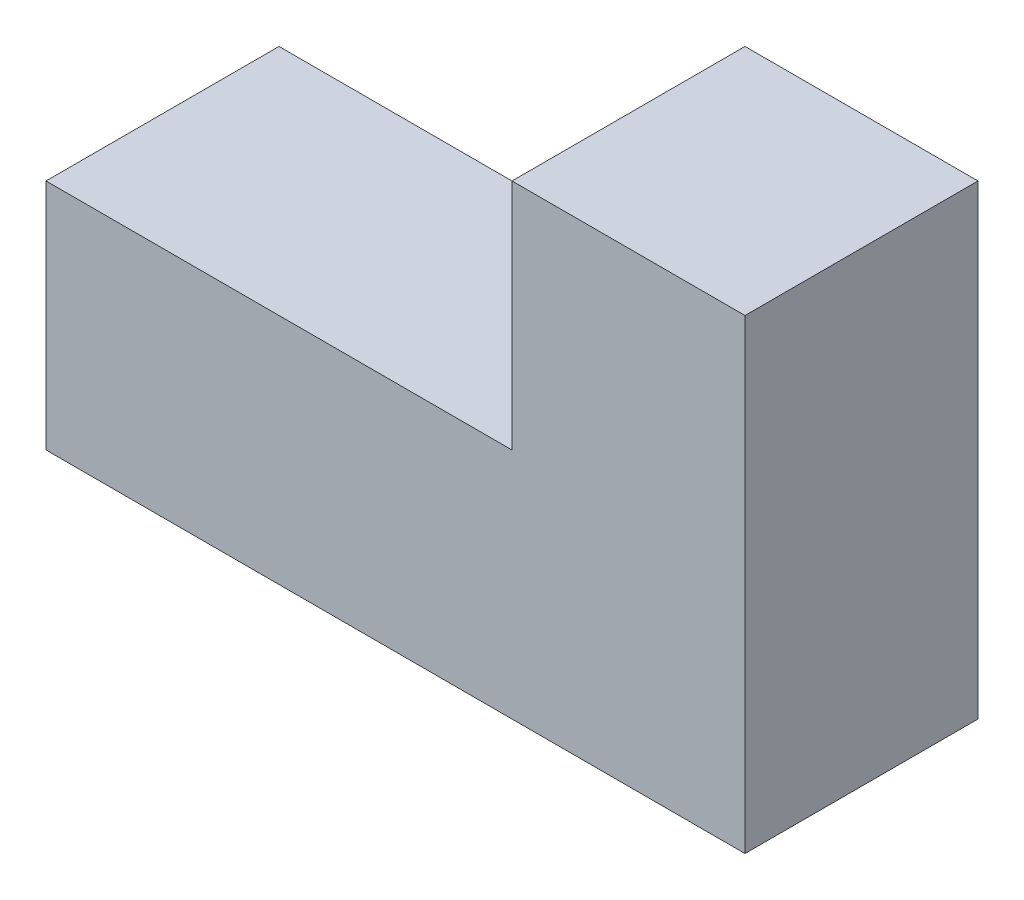
ISO-10303-21;
HEADER;
FILE_DESCRIPTION(('STEP AP214'),'2;1');
FILE_NAME('part.step','',(''),(''),'','','');
FILE_SCHEMA(('AUTOMOTIVE_DESIGN { 1 0 10303 214 1 1 1 1 }'));
ENDSEC;
DATA;
#1=APPLICATION_CONTEXT('core data for automotive mechanical design processes');
#2=APPLICATION_PROTOCOL_DEFINITION('international standard','automotive_design',2000,#1);
#3=PRODUCT_CONTEXT('',#1,'mechanical');
#4=PRODUCT('Part','Part','',(#3));
#5=PRODUCT_RELATED_PRODUCT_CATEGORY('part','',(#4));
#6=PRODUCT_DEFINITION_FORMATION('','',#4);
#7=PRODUCT_DEFINITION_CONTEXT('part definition',#1,'design');
#8=PRODUCT_DEFINITION('design','',#6,#7);
#9=PRODUCT_DEFINITION_SHAPE('','',#8);
#10=(LENGTH_UNIT() NAMED_UNIT(*) SI_UNIT(.MILLI.,.METRE.));
#11=(NAMED_UNIT(*) PLANE_ANGLE_UNIT() SI_UNIT($,.RADIAN.));
#12=(NAMED_UNIT(*) SI_UNIT($,.STERADIAN.) SOLID_ANGLE_UNIT());
#13=UNCERTAINTY_MEASURE_WITH_UNIT(LENGTH_MEASURE(1.E-05),#10,'distance_accuracy_value','');
#14=(GEOMETRIC_REPRESENTATION_CONTEXT(3) GLOBAL_UNCERTAINTY_ASSIGNED_CONTEXT((#13)) GLOBAL_UNIT_ASSIGNED_CONTEXT((#10,
#11,#12)) REPRESENTATION_CONTEXT('',''));
#15=CARTESIAN_POINT('',(0.,0.,0.));
#16=DIRECTION('',(0.,0.,1.));
#17=DIRECTION('',(1.,0.,0.));
#18=AXIS2_PLACEMENT_3D('',#15,#16,#17);
#19=CARTESIAN_POINT('',(0.,300.,300.));
#20=DIRECTION('',(1.,0.,0.));
#21=DIRECTION('',(0.,0.,-1.));
#22=AXIS2_PLACEMENT_3D('',#19,#20,#21);
#23=PLANE('',#22);
#24=DIRECTION('',(0.,-1.,0.));
#25=VECTOR('',#24,1.);
#26=CARTESIAN_POINT('',(0.,300.,0.));
#27=LINE('',#26,#25);
#28=CARTESIAN_POINT('',(0.,300.,0.));
#29=VERTEX_POINT('',#28);
#30=CARTESIAN_POINT('',(0.,0.,0.));
#31=VERTEX_POINT('',#30);
#32=EDGE_CURVE('E128',#29,#31,#27,.T.);
#33=ORIENTED_EDGE('',*,*,#32,.T.);
#34=DIRECTION('',(0.,0.,-1.));
#35=VECTOR('',#34,1.);
#36=CARTESIAN_POINT('',(0.,0.,300.));
#37=LINE('',#36,#35);
#38=CARTESIAN_POINT('',(0.,0.,300.));
#39=VERTEX_POINT('',#38);
#40=EDGE_CURVE('E11',#39,#31,#37,.T.);
#41=ORIENTED_EDGE('',*,*,#40,.F.);
#42=DIRECTION('',(0.,-1.,0.));
#43=VECTOR('',#42,1.);
#44=CARTESIAN_POINT('',(0.,300.,300.));
#45=LINE('',#44,#43);
#46=CARTESIAN_POINT('',(0.,300.,300.));
#47=VERTEX_POINT('',#46);
#48=EDGE_CURVE('E144',#47,#39,#45,.T.);
#49=ORIENTED_EDGE('',*,*,#48,.F.);
#50=DIRECTION('',(0.,0.,-1.));
#51=VECTOR('',#50,1.);
#52=CARTESIAN_POINT('',(0.,300.,300.));
#53=LINE('',#52,#51);
#54=EDGE_CURVE('E124',#47,#29,#53,.T.);
#55=ORIENTED_EDGE('',*,*,#54,.T.);
#56=EDGE_LOOP('',(#33,#41,#49,#55));
#57=FACE_BOUND('',#56,.T.);
#58=ADVANCED_FACE('F39',(#57),#23,.F.);
#59=CARTESIAN_POINT('',(0.,0.,300.));
#60=DIRECTION('',(0.,1.,0.));
#61=DIRECTION('',(0.,0.,1.));
#62=AXIS2_PLACEMENT_3D('',#59,#60,#61);
#63=PLANE('',#62);
#64=DIRECTION('',(1.,0.,0.));
#65=VECTOR('',#64,1.);
#66=CARTESIAN_POINT('',(0.,0.,0.));
#67=LINE('',#66,#65);
#68=CARTESIAN_POINT('',(900.,0.,0.));
#69=VERTEX_POINT('',#68);
#70=EDGE_CURVE('E132',#31,#69,#67,.T.);
#71=ORIENTED_EDGE('',*,*,#70,.T.);
#72=DIRECTION('',(0.,0.,-1.));
#73=VECTOR('',#72,1.);
#74=CARTESIAN_POINT('',(900.,0.,300.));
#75=LINE('',#74,#73);
#76=CARTESIAN_POINT('',(900.,0.,300.));
#77=VERTEX_POINT('',#76);
#78=EDGE_CURVE('E48',#77,#69,#75,.T.);
#79=ORIENTED_EDGE('',*,*,#78,.F.);
#80=DIRECTION('',(1.,0.,0.));
#81=VECTOR('',#80,1.);
#82=CARTESIAN_POINT('',(0.,0.,300.));
#83=LINE('',#82,#81);
#84=EDGE_CURVE('E93',#39,#77,#83,.T.);
#85=ORIENTED_EDGE('',*,*,#84,.F.);
#86=ORIENTED_EDGE('',*,*,#40,.T.);
#87=EDGE_LOOP('',(#71,#79,#85,#86));
#88=FACE_BOUND('',#87,.T.);
#89=ADVANCED_FACE('F172',(#88),#63,.F.);
#90=CARTESIAN_POINT('',(900.,0.,300.));
#91=DIRECTION('',(-1.,0.,0.));
#92=DIRECTION('',(0.,0.,1.));
#93=AXIS2_PLACEMENT_3D('',#90,#91,#92);
#94=PLANE('',#93);
#95=DIRECTION('',(0.,1.,0.));
#96=VECTOR('',#95,1.);
#97=CARTESIAN_POINT('',(900.,0.,0.));
#98=LINE('',#97,#96);
#99=CARTESIAN_POINT('',(900.,600.,0.));
#100=VERTEX_POINT('',#99);
#101=EDGE_CURVE('E135',#69,#100,#98,.T.);
#102=ORIENTED_EDGE('',*,*,#101,.T.);
#103=DIRECTION('',(0.,0.,-1.));
#104=VECTOR('',#103,1.);
#105=CARTESIAN_POINT('',(900.,600.,300.));
#106=LINE('',#105,#104);
#107=CARTESIAN_POINT('',(900.,600.,300.));
#108=VERTEX_POINT('',#107);
#109=EDGE_CURVE('E117',#108,#100,#106,.T.);
#110=ORIENTED_EDGE('',*,*,#109,.F.);
#111=DIRECTION('',(0.,1.,0.));
#112=VECTOR('',#111,1.);
#113=CARTESIAN_POINT('',(900.,0.,300.));
#114=LINE('',#113,#112);
#115=EDGE_CURVE('E106',#77,#108,#114,.T.);
#116=ORIENTED_EDGE('',*,*,#115,.F.);
#117=ORIENTED_EDGE('',*,*,#78,.T.);
#118=EDGE_LOOP('',(#102,#110,#116,#117));
#119=FACE_BOUND('',#118,.T.);
#120=ADVANCED_FACE('F154',(#119),#94,.F.);
#121=CARTESIAN_POINT('',(900.,600.,300.));
#122=DIRECTION('',(0.,-1.,0.));
#123=DIRECTION('',(0.,0.,-1.));
#124=AXIS2_PLACEMENT_3D('',#121,#122,#123);
#125=PLANE('',#124);
#126=DIRECTION('',(-1.,0.,0.));
#127=VECTOR('',#126,1.);
#128=CARTESIAN_POINT('',(900.,600.,0.));
#129=LINE('',#128,#127);
#130=CARTESIAN_POINT('',(600.,600.,0.));
#131=VERTEX_POINT('',#130);
#132=EDGE_CURVE('E115',#100,#131,#129,.T.);
#133=ORIENTED_EDGE('',*,*,#132,.T.);
#134=DIRECTION('',(0.,0.,-1.));
#135=VECTOR('',#134,1.);
#136=CARTESIAN_POINT('',(600.,600.,300.));
#137=LINE('',#136,#135);
#138=CARTESIAN_POINT('',(600.,600.,300.));
#139=VERTEX_POINT('',#138);
#140=EDGE_CURVE('E112',#139,#131,#137,.T.);
#141=ORIENTED_EDGE('',*,*,#140,.F.);
#142=DIRECTION('',(-1.,0.,0.));
#143=VECTOR('',#142,1.);
#144=CARTESIAN_POINT('',(900.,600.,300.));
#145=LINE('',#144,#143);
#146=EDGE_CURVE('E100',#108,#139,#145,.T.);
#147=ORIENTED_EDGE('',*,*,#146,.F.);
#148=ORIENTED_EDGE('',*,*,#109,.T.);
#149=EDGE_LOOP('',(#133,#141,#147,#148));
#150=FACE_BOUND('',#149,.T.);
#151=ADVANCED_FACE('F113',(#150),#125,.F.);
#152=CARTESIAN_POINT('',(600.,600.,300.));
#153=DIRECTION('',(1.,0.,0.));
#154=DIRECTION('',(0.,0.,-1.));
#155=AXIS2_PLACEMENT_3D('',#152,#153,#154);
#156=PLANE('',#155);
#157=DIRECTION('',(0.,-1.,0.));
#158=VECTOR('',#157,1.);
#159=CARTESIAN_POINT('',(600.,600.,0.));
#160=LINE('',#159,#158);
#161=CARTESIAN_POINT('',(600.,300.,0.));
#162=VERTEX_POINT('',#161);
#163=EDGE_CURVE('E79',#131,#162,#160,.T.);
#164=ORIENTED_EDGE('',*,*,#163,.T.);
#165=DIRECTION('',(0.,0.,-1.));
#166=VECTOR('',#165,1.);
#167=CARTESIAN_POINT('',(600.,300.,300.));
#168=LINE('',#167,#166);
#169=CARTESIAN_POINT('',(600.,300.,300.));
#170=VERTEX_POINT('',#169);
#171=EDGE_CURVE('E118',#170,#162,#168,.T.);
#172=ORIENTED_EDGE('',*,*,#171,.F.);
#173=DIRECTION('',(0.,-1.,0.));
#174=VECTOR('',#173,1.);
#175=CARTESIAN_POINT('',(600.,600.,300.));
#176=LINE('',#175,#174);
#177=EDGE_CURVE('E104',#139,#170,#176,.T.);
#178=ORIENTED_EDGE('',*,*,#177,.F.);
#179=ORIENTED_EDGE('',*,*,#140,.T.);
#180=EDGE_LOOP('',(#164,#172,#178,#179));
#181=FACE_BOUND('',#180,.T.);
#182=ADVANCED_FACE('F120',(#181),#156,.F.);
#183=CARTESIAN_POINT('',(600.,300.,300.));
#184=DIRECTION('',(0.,-1.,0.));
#185=DIRECTION('',(1.,0.,0.));
#186=AXIS2_PLACEMENT_3D('',#183,#184,#185);
#187=PLANE('',#186);
#188=DIRECTION('',(-1.,0.,0.));
#189=VECTOR('',#188,1.);
#190=CARTESIAN_POINT('',(600.,300.,0.));
#191=LINE('',#190,#189);
#192=EDGE_CURVE('E85',#162,#29,#191,.T.);
#193=ORIENTED_EDGE('',*,*,#192,.T.);
#194=ORIENTED_EDGE('',*,*,#54,.F.);
#195=DIRECTION('',(-1.,0.,0.));
#196=VECTOR('',#195,1.);
#197=CARTESIAN_POINT('',(600.,300.,300.));
#198=LINE('',#197,#196);
#199=EDGE_CURVE('E56',#170,#47,#198,.T.);
#200=ORIENTED_EDGE('',*,*,#199,.F.);
#201=ORIENTED_EDGE('',*,*,#171,.T.);
#202=EDGE_LOOP('',(#193,#194,#200,#201));
#203=FACE_BOUND('',#202,.T.);
#204=ADVANCED_FACE('F161',(#203),#187,.F.);
#205=CARTESIAN_POINT('',(0.,0.,300.));
#206=DIRECTION('',(0.,0.,1.));
#207=DIRECTION('',(1.,0.,0.));
#208=AXIS2_PLACEMENT_3D('',#205,#206,#207);
#209=PLANE('',#208);
#210=ORIENTED_EDGE('',*,*,#48,.T.);
#211=ORIENTED_EDGE('',*,*,#84,.T.);
#212=ORIENTED_EDGE('',*,*,#115,.T.);
#213=ORIENTED_EDGE('',*,*,#146,.T.);
#214=ORIENTED_EDGE('',*,*,#177,.T.);
#215=ORIENTED_EDGE('',*,*,#199,.T.);
#216=EDGE_LOOP('',(#210,#211,#212,#213,#214,#215));
#217=FACE_BOUND('',#216,.T.);
#218=ADVANCED_FACE('F102',(#217),#209,.T.);
#219=CARTESIAN_POINT('',(0.,0.,0.));
#220=DIRECTION('',(0.,0.,1.));
#221=DIRECTION('',(1.,0.,0.));
#222=AXIS2_PLACEMENT_3D('',#219,#220,#221);
#223=PLANE('',#222);
#224=ORIENTED_EDGE('',*,*,#32,.F.);
#225=ORIENTED_EDGE('',*,*,#192,.F.);
#226=ORIENTED_EDGE('',*,*,#163,.F.);
#227=ORIENTED_EDGE('',*,*,#132,.F.);
#228=ORIENTED_EDGE('',*,*,#101,.F.);
#229=ORIENTED_EDGE('',*,*,#70,.F.);
#230=EDGE_LOOP('',(#224,#225,#226,#227,#228,#229));
#231=FACE_BOUND('',#230,.T.);
#232=ADVANCED_FACE('F157',(#231),#223,.F.);
#233=CLOSED_SHELL('',(#58,#89,#120,#151,#182,#204,#218,#232));
#234=MANIFOLD_SOLID_BREP('B2',#233);
#235=ADVANCED_BREP_SHAPE_REPRESENTATION('',(#18,#234),#14);
#236=SHAPE_DEFINITION_REPRESENTATION(#9,#235);
ENDSEC;
END-ISO-10303-21;
